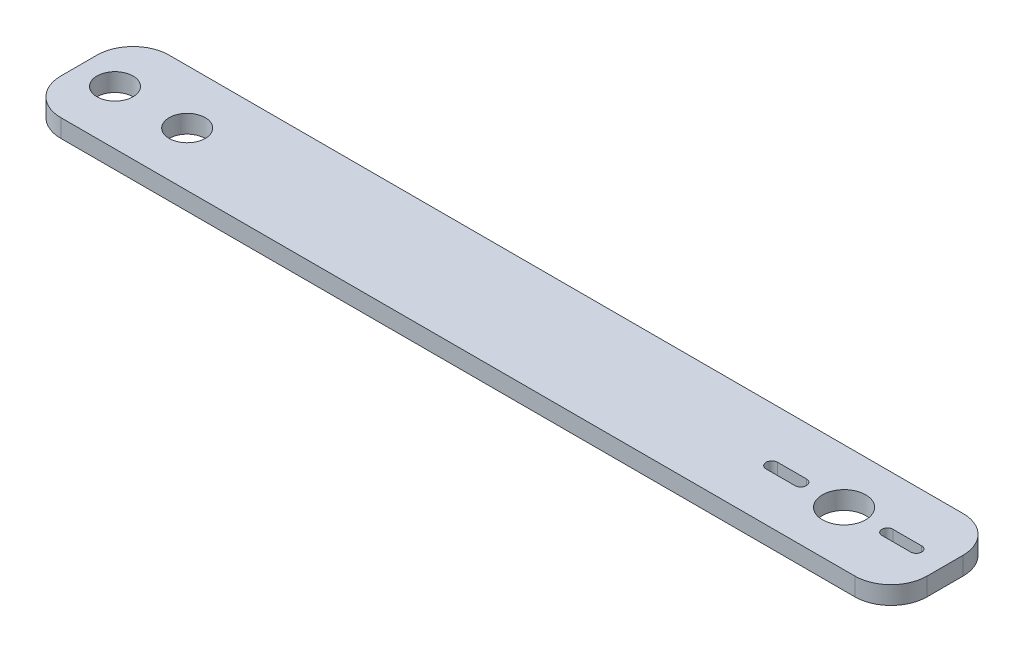
ISO-10303-21;
HEADER;
FILE_DESCRIPTION(('STEP AP214'),'2;1');
FILE_NAME('part.step','',(''),(''),'','','');
FILE_SCHEMA(('AUTOMOTIVE_DESIGN { 1 0 10303 214 1 1 1 1 }'));
ENDSEC;
DATA;
#1=APPLICATION_CONTEXT('core data for automotive mechanical design processes');
#2=APPLICATION_PROTOCOL_DEFINITION('international standard','automotive_design',2000,#1);
#3=PRODUCT_CONTEXT('',#1,'mechanical');
#4=PRODUCT('Part','Part','',(#3));
#5=PRODUCT_RELATED_PRODUCT_CATEGORY('part','',(#4));
#6=PRODUCT_DEFINITION_FORMATION('','',#4);
#7=PRODUCT_DEFINITION_CONTEXT('part definition',#1,'design');
#8=PRODUCT_DEFINITION('design','',#6,#7);
#9=PRODUCT_DEFINITION_SHAPE('','',#8);
#10=(LENGTH_UNIT() NAMED_UNIT(*) SI_UNIT(.MILLI.,.METRE.));
#11=(NAMED_UNIT(*) PLANE_ANGLE_UNIT() SI_UNIT($,.RADIAN.));
#12=(NAMED_UNIT(*) SI_UNIT($,.STERADIAN.) SOLID_ANGLE_UNIT());
#13=UNCERTAINTY_MEASURE_WITH_UNIT(LENGTH_MEASURE(1.E-05),#10,'distance_accuracy_value','');
#14=(GEOMETRIC_REPRESENTATION_CONTEXT(3) GLOBAL_UNCERTAINTY_ASSIGNED_CONTEXT((#13)) GLOBAL_UNIT_ASSIGNED_CONTEXT((#10,
#11,#12)) REPRESENTATION_CONTEXT('',''));
#15=CARTESIAN_POINT('',(0.,0.,0.));
#16=DIRECTION('',(0.,0.,1.));
#17=DIRECTION('',(1.,0.,0.));
#18=AXIS2_PLACEMENT_3D('',#15,#16,#17);
#19=CARTESIAN_POINT('',(-54.3979810745286,3.175,-16.9498549690388));
#20=DIRECTION('',(1.,0.,0.));
#21=DIRECTION('',(0.,0.,-1.));
#22=AXIS2_PLACEMENT_3D('',#19,#20,#21);
#23=PLANE('',#22);
#24=DIRECTION('',(0.,0.,1.));
#25=VECTOR('',#24,1.);
#26=CARTESIAN_POINT('',(-54.3979810745286,3.175,-16.9498549690388));
#27=LINE('',#26,#25);
#28=CARTESIAN_POINT('',(-54.3979810745286,3.175,-10.5998549690389));
#29=VERTEX_POINT('',#28);
#30=CARTESIAN_POINT('',(-54.3979810745286,3.175,-4.24985496903885));
#31=VERTEX_POINT('',#30);
#32=EDGE_CURVE('E231',#29,#31,#27,.T.);
#33=ORIENTED_EDGE('',*,*,#32,.F.);
#34=DIRECTION('',(0.,-1.,0.));
#35=VECTOR('',#34,1.);
#36=CARTESIAN_POINT('',(-54.3979810745286,3.175,-10.5998549690388));
#37=LINE('',#36,#35);
#38=CARTESIAN_POINT('',(-54.3979810745286,0.,-10.5998549690389));
#39=VERTEX_POINT('',#38);
#40=EDGE_CURVE('E11',#29,#39,#37,.T.);
#41=ORIENTED_EDGE('',*,*,#40,.T.);
#42=DIRECTION('',(0.,0.,1.));
#43=VECTOR('',#42,1.);
#44=CARTESIAN_POINT('',(-54.3979810745286,0.,-16.9498549690388));
#45=LINE('',#44,#43);
#46=CARTESIAN_POINT('',(-54.3979810745286,0.,-4.24985496903885));
#47=VERTEX_POINT('',#46);
#48=EDGE_CURVE('E245',#39,#47,#45,.T.);
#49=ORIENTED_EDGE('',*,*,#48,.T.);
#50=DIRECTION('',(0.,-1.,0.));
#51=VECTOR('',#50,1.);
#52=CARTESIAN_POINT('',(-54.3979810745286,3.175,-4.24985496903885));
#53=LINE('',#52,#51);
#54=EDGE_CURVE('E42',#47,#31,#53,.F.);
#55=ORIENTED_EDGE('',*,*,#54,.T.);
#56=EDGE_LOOP('',(#33,#41,#49,#55));
#57=FACE_BOUND('',#56,.T.);
#58=ADVANCED_FACE('F34',(#57),#23,.F.);
#59=CARTESIAN_POINT('',(-54.3979810745286,3.175,2.10014503096115));
#60=DIRECTION('',(0.,0.,-1.));
#61=DIRECTION('',(-1.,0.,0.));
#62=AXIS2_PLACEMENT_3D('',#59,#60,#61);
#63=PLANE('',#62);
#64=DIRECTION('',(1.,0.,0.));
#65=VECTOR('',#64,1.);
#66=CARTESIAN_POINT('',(-54.3979810745286,0.,2.10014503096115));
#67=LINE('',#66,#65);
#68=CARTESIAN_POINT('',(-48.0479810745286,0.,2.10014503096115));
#69=VERTEX_POINT('',#68);
#70=CARTESIAN_POINT('',(91.6520189254713,0.,2.10014503096115));
#71=VERTEX_POINT('',#70);
#72=EDGE_CURVE('E248',#69,#71,#67,.T.);
#73=ORIENTED_EDGE('',*,*,#72,.T.);
#74=DIRECTION('',(0.,-1.,0.));
#75=VECTOR('',#74,1.);
#76=CARTESIAN_POINT('',(91.6520189254714,3.175,2.10014503096115));
#77=LINE('',#76,#75);
#78=CARTESIAN_POINT('',(91.6520189254713,3.175,2.10014503096115));
#79=VERTEX_POINT('',#78);
#80=EDGE_CURVE('E285',#71,#79,#77,.F.);
#81=ORIENTED_EDGE('',*,*,#80,.T.);
#82=DIRECTION('',(1.,0.,0.));
#83=VECTOR('',#82,1.);
#84=CARTESIAN_POINT('',(-54.3979810745286,3.175,2.10014503096115));
#85=LINE('',#84,#83);
#86=CARTESIAN_POINT('',(-48.0479810745286,3.175,2.10014503096115));
#87=VERTEX_POINT('',#86);
#88=EDGE_CURVE('E234',#87,#79,#85,.T.);
#89=ORIENTED_EDGE('',*,*,#88,.F.);
#90=DIRECTION('',(0.,-1.,0.));
#91=VECTOR('',#90,1.);
#92=CARTESIAN_POINT('',(-48.0479810745286,3.175,2.10014503096115));
#93=LINE('',#92,#91);
#94=EDGE_CURVE('E282',#87,#69,#93,.T.);
#95=ORIENTED_EDGE('',*,*,#94,.T.);
#96=EDGE_LOOP('',(#73,#81,#89,#95));
#97=FACE_BOUND('',#96,.T.);
#98=ADVANCED_FACE('F300',(#97),#63,.F.);
#99=CARTESIAN_POINT('',(98.0020189254714,3.175,-16.9498549690388));
#100=DIRECTION('',(-1.,0.,0.));
#101=DIRECTION('',(0.,0.,1.));
#102=AXIS2_PLACEMENT_3D('',#99,#100,#101);
#103=PLANE('',#102);
#104=DIRECTION('',(0.,0.,-1.));
#105=VECTOR('',#104,1.);
#106=CARTESIAN_POINT('',(98.0020189254714,0.,-16.9498549690388));
#107=LINE('',#106,#105);
#108=CARTESIAN_POINT('',(98.0020189254714,0.,-4.24985496903885));
#109=VERTEX_POINT('',#108);
#110=CARTESIAN_POINT('',(98.0020189254714,0.,-10.5998549690389));
#111=VERTEX_POINT('',#110);
#112=EDGE_CURVE('E252',#109,#111,#107,.T.);
#113=ORIENTED_EDGE('',*,*,#112,.T.);
#114=DIRECTION('',(0.,-1.,0.));
#115=VECTOR('',#114,1.);
#116=CARTESIAN_POINT('',(98.0020189254714,3.175,-10.5998549690388));
#117=LINE('',#116,#115);
#118=CARTESIAN_POINT('',(98.0020189254714,3.175,-10.5998549690389));
#119=VERTEX_POINT('',#118);
#120=EDGE_CURVE('E272',#111,#119,#117,.F.);
#121=ORIENTED_EDGE('',*,*,#120,.T.);
#122=DIRECTION('',(0.,0.,-1.));
#123=VECTOR('',#122,1.);
#124=CARTESIAN_POINT('',(98.0020189254714,3.175,-16.9498549690388));
#125=LINE('',#124,#123);
#126=CARTESIAN_POINT('',(98.0020189254714,3.175,-4.24985496903885));
#127=VERTEX_POINT('',#126);
#128=EDGE_CURVE('E238',#127,#119,#125,.T.);
#129=ORIENTED_EDGE('',*,*,#128,.F.);
#130=DIRECTION('',(0.,-1.,0.));
#131=VECTOR('',#130,1.);
#132=CARTESIAN_POINT('',(98.0020189254714,3.175,-4.24985496903885));
#133=LINE('',#132,#131);
#134=EDGE_CURVE('E269',#127,#109,#133,.T.);
#135=ORIENTED_EDGE('',*,*,#134,.T.);
#136=EDGE_LOOP('',(#113,#121,#129,#135));
#137=FACE_BOUND('',#136,.T.);
#138=ADVANCED_FACE('F311',(#137),#103,.F.);
#139=CARTESIAN_POINT('',(-54.3979810745286,3.175,-16.9498549690388));
#140=DIRECTION('',(0.,0.,1.));
#141=DIRECTION('',(1.,0.,0.));
#142=AXIS2_PLACEMENT_3D('',#139,#140,#141);
#143=PLANE('',#142);
#144=DIRECTION('',(-1.,0.,0.));
#145=VECTOR('',#144,1.);
#146=CARTESIAN_POINT('',(-54.3979810745286,3.175,-16.9498549690388));
#147=LINE('',#146,#145);
#148=CARTESIAN_POINT('',(91.6520189254713,3.175,-16.9498549690388));
#149=VERTEX_POINT('',#148);
#150=CARTESIAN_POINT('',(-48.0479810745286,3.175,-16.9498549690388));
#151=VERTEX_POINT('',#150);
#152=EDGE_CURVE('E241',#149,#151,#147,.T.);
#153=ORIENTED_EDGE('',*,*,#152,.F.);
#154=DIRECTION('',(0.,-1.,0.));
#155=VECTOR('',#154,1.);
#156=CARTESIAN_POINT('',(91.6520189254714,3.175,-16.9498549690388));
#157=LINE('',#156,#155);
#158=CARTESIAN_POINT('',(91.6520189254713,0.,-16.9498549690388));
#159=VERTEX_POINT('',#158);
#160=EDGE_CURVE('E258',#149,#159,#157,.T.);
#161=ORIENTED_EDGE('',*,*,#160,.T.);
#162=DIRECTION('',(-1.,0.,0.));
#163=VECTOR('',#162,1.);
#164=CARTESIAN_POINT('',(-54.3979810745286,0.,-16.9498549690388));
#165=LINE('',#164,#163);
#166=CARTESIAN_POINT('',(-48.0479810745286,0.,-16.9498549690388));
#167=VERTEX_POINT('',#166);
#168=EDGE_CURVE('E235',#159,#167,#165,.T.);
#169=ORIENTED_EDGE('',*,*,#168,.T.);
#170=DIRECTION('',(0.,-1.,0.));
#171=VECTOR('',#170,1.);
#172=CARTESIAN_POINT('',(-48.0479810745286,3.175,-16.9498549690388));
#173=LINE('',#172,#171);
#174=EDGE_CURVE('E244',#167,#151,#173,.F.);
#175=ORIENTED_EDGE('',*,*,#174,.T.);
#176=EDGE_LOOP('',(#153,#161,#169,#175));
#177=FACE_BOUND('',#176,.T.);
#178=ADVANCED_FACE('F319',(#177),#143,.F.);
#179=CARTESIAN_POINT('',(0.,3.175,0.));
#180=DIRECTION('',(0.,1.,0.));
#181=DIRECTION('',(0.,0.,1.));
#182=AXIS2_PLACEMENT_3D('',#179,#180,#181);
#183=PLANE('',#182);
#184=CARTESIAN_POINT('',(-48.0479810745286,3.175,-7.42485496903885));
#185=DIRECTION('',(0.,1.,0.));
#186=DIRECTION('',(0.,0.,1.));
#187=AXIS2_PLACEMENT_3D('',#184,#185,#186);
#188=CIRCLE('',#187,3.175);
#189=CARTESIAN_POINT('',(-48.0479810745286,3.175,-4.24985496903885));
#190=VERTEX_POINT('',#189);
#191=EDGE_CURVE('E174',#190,#190,#188,.T.);
#192=ORIENTED_EDGE('',*,*,#191,.F.);
#193=EDGE_LOOP('',(#192));
#194=FACE_BOUND('',#193,.T.);
#195=CARTESIAN_POINT('',(72.6020189254714,3.175,-7.42485496903885));
#196=DIRECTION('',(0.,1.,0.));
#197=DIRECTION('',(0.,0.,1.));
#198=AXIS2_PLACEMENT_3D('',#195,#196,#197);
#199=CIRCLE('',#198,1.016);
#200=CARTESIAN_POINT('',(72.6020189254714,3.175,-6.40885496903885));
#201=VERTEX_POINT('',#200);
#202=CARTESIAN_POINT('',(72.6020189254714,3.175,-8.44085496903885));
#203=VERTEX_POINT('',#202);
#204=EDGE_CURVE('E49',#201,#203,#199,.T.);
#205=ORIENTED_EDGE('',*,*,#204,.F.);
#206=DIRECTION('',(1.,0.,0.));
#207=VECTOR('',#206,1.);
#208=CARTESIAN_POINT('',(72.6020189254714,3.175,-6.40885496903885));
#209=LINE('',#208,#207);
#210=CARTESIAN_POINT('',(67.5220189254714,3.175,-6.40885496903885));
#211=VERTEX_POINT('',#210);
#212=EDGE_CURVE('E195',#211,#201,#209,.T.);
#213=ORIENTED_EDGE('',*,*,#212,.F.);
#214=CARTESIAN_POINT('',(67.5220189254714,3.175,-7.42485496903885));
#215=DIRECTION('',(0.,1.,0.));
#216=DIRECTION('',(0.,0.,1.));
#217=AXIS2_PLACEMENT_3D('',#214,#215,#216);
#218=CIRCLE('',#217,1.016);
#219=CARTESIAN_POINT('',(67.5220189254714,3.175,-8.44085496903885));
#220=VERTEX_POINT('',#219);
#221=EDGE_CURVE('E209',#220,#211,#218,.T.);
#222=ORIENTED_EDGE('',*,*,#221,.F.);
#223=DIRECTION('',(-1.,0.,0.));
#224=VECTOR('',#223,1.);
#225=CARTESIAN_POINT('',(72.6020189254714,3.175,-8.44085496903885));
#226=LINE('',#225,#224);
#227=EDGE_CURVE('E206',#203,#220,#226,.T.);
#228=ORIENTED_EDGE('',*,*,#227,.F.);
#229=EDGE_LOOP('',(#205,#213,#222,#228));
#230=FACE_BOUND('',#229,.T.);
#231=CARTESIAN_POINT('',(87.8420189254714,3.175,-7.42485496903885));
#232=DIRECTION('',(0.,1.,0.));
#233=DIRECTION('',(0.,0.,1.));
#234=AXIS2_PLACEMENT_3D('',#231,#232,#233);
#235=CIRCLE('',#234,0.9525);
#236=CARTESIAN_POINT('',(87.8420189254714,3.175,-8.37735496903885));
#237=VERTEX_POINT('',#236);
#238=CARTESIAN_POINT('',(87.8420189254714,3.175,-6.47235496903885));
#239=VERTEX_POINT('',#238);
#240=EDGE_CURVE('E57',#237,#239,#235,.T.);
#241=ORIENTED_EDGE('',*,*,#240,.F.);
#242=DIRECTION('',(-1.,0.,0.));
#243=VECTOR('',#242,1.);
#244=CARTESIAN_POINT('',(87.8420189254714,3.175,-8.37735496903885));
#245=LINE('',#244,#243);
#246=CARTESIAN_POINT('',(92.9220189254714,3.175,-8.37735496903885));
#247=VERTEX_POINT('',#246);
#248=EDGE_CURVE('E168',#247,#237,#245,.T.);
#249=ORIENTED_EDGE('',*,*,#248,.F.);
#250=CARTESIAN_POINT('',(92.9220189254714,3.175,-7.42485496903885));
#251=DIRECTION('',(0.,1.,0.));
#252=DIRECTION('',(0.,0.,1.));
#253=AXIS2_PLACEMENT_3D('',#250,#251,#252);
#254=CIRCLE('',#253,0.952500000000002);
#255=CARTESIAN_POINT('',(92.9220189254714,3.175,-6.47235496903885));
#256=VERTEX_POINT('',#255);
#257=EDGE_CURVE('E171',#256,#247,#254,.T.);
#258=ORIENTED_EDGE('',*,*,#257,.F.);
#259=DIRECTION('',(1.,0.,0.));
#260=VECTOR('',#259,1.);
#261=CARTESIAN_POINT('',(87.8420189254714,3.175,-6.47235496903885));
#262=LINE('',#261,#260);
#263=EDGE_CURVE('E180',#239,#256,#262,.T.);
#264=ORIENTED_EDGE('',*,*,#263,.F.);
#265=EDGE_LOOP('',(#241,#249,#258,#264));
#266=FACE_BOUND('',#265,.T.);
#267=CARTESIAN_POINT('',(80.2220189254714,3.175,-7.42485496903885));
#268=DIRECTION('',(0.,1.,0.));
#269=DIRECTION('',(0.,0.,1.));
#270=AXIS2_PLACEMENT_3D('',#267,#268,#269);
#271=CIRCLE('',#270,3.81);
#272=CARTESIAN_POINT('',(80.2220189254714,3.175,-3.61485496903885));
#273=VERTEX_POINT('',#272);
#274=EDGE_CURVE('E187',#273,#273,#271,.T.);
#275=ORIENTED_EDGE('',*,*,#274,.F.);
#276=EDGE_LOOP('',(#275));
#277=FACE_BOUND('',#276,.T.);
#278=CARTESIAN_POINT('',(-35.3479810745286,3.175,-7.42485496903885));
#279=DIRECTION('',(0.,1.,0.));
#280=DIRECTION('',(0.,0.,1.));
#281=AXIS2_PLACEMENT_3D('',#278,#279,#280);
#282=CIRCLE('',#281,3.175);
#283=CARTESIAN_POINT('',(-35.3479810745286,3.175,-4.24985496903885));
#284=VERTEX_POINT('',#283);
#285=EDGE_CURVE('E223',#284,#284,#282,.T.);
#286=ORIENTED_EDGE('',*,*,#285,.F.);
#287=EDGE_LOOP('',(#286));
#288=FACE_BOUND('',#287,.T.);
#289=ORIENTED_EDGE('',*,*,#128,.T.);
#290=CARTESIAN_POINT('',(91.6520189254714,3.175,-10.5998549690388));
#291=DIRECTION('',(0.,1.,0.));
#292=DIRECTION('',(0.,0.,1.));
#293=AXIS2_PLACEMENT_3D('',#290,#291,#292);
#294=CIRCLE('',#293,6.35);
#295=EDGE_CURVE('E280',#119,#149,#294,.T.);
#296=ORIENTED_EDGE('',*,*,#295,.T.);
#297=ORIENTED_EDGE('',*,*,#152,.T.);
#298=CARTESIAN_POINT('',(-48.0479810745286,3.175,-10.5998549690388));
#299=DIRECTION('',(0.,1.,0.));
#300=DIRECTION('',(0.,0.,1.));
#301=AXIS2_PLACEMENT_3D('',#298,#299,#300);
#302=CIRCLE('',#301,6.35);
#303=EDGE_CURVE('E276',#151,#29,#302,.T.);
#304=ORIENTED_EDGE('',*,*,#303,.T.);
#305=ORIENTED_EDGE('',*,*,#32,.T.);
#306=CARTESIAN_POINT('',(-48.0479810745286,3.175,-4.24985496903885));
#307=DIRECTION('',(0.,1.,0.));
#308=DIRECTION('',(0.,0.,1.));
#309=AXIS2_PLACEMENT_3D('',#306,#307,#308);
#310=CIRCLE('',#309,6.35);
#311=EDGE_CURVE('E274',#31,#87,#310,.T.);
#312=ORIENTED_EDGE('',*,*,#311,.T.);
#313=ORIENTED_EDGE('',*,*,#88,.T.);
#314=CARTESIAN_POINT('',(91.6520189254714,3.175,-4.24985496903885));
#315=DIRECTION('',(0.,1.,0.));
#316=DIRECTION('',(0.,0.,1.));
#317=AXIS2_PLACEMENT_3D('',#314,#315,#316);
#318=CIRCLE('',#317,6.35);
#319=EDGE_CURVE('E278',#79,#127,#318,.T.);
#320=ORIENTED_EDGE('',*,*,#319,.T.);
#321=EDGE_LOOP('',(#289,#296,#297,#304,#305,#312,#313,#320));
#322=FACE_BOUND('',#321,.T.);
#323=ADVANCED_FACE('F294',(#194,#230,#266,#277,#288,#322),#183,.T.);
#324=CARTESIAN_POINT('',(0.,0.,0.));
#325=DIRECTION('',(0.,1.,0.));
#326=DIRECTION('',(0.,0.,1.));
#327=AXIS2_PLACEMENT_3D('',#324,#325,#326);
#328=PLANE('',#327);
#329=CARTESIAN_POINT('',(-48.0479810745286,0.,-7.42485496903885));
#330=DIRECTION('',(0.,1.,0.));
#331=DIRECTION('',(0.,0.,1.));
#332=AXIS2_PLACEMENT_3D('',#329,#330,#331);
#333=CIRCLE('',#332,3.175);
#334=CARTESIAN_POINT('',(-48.0479810745286,0.,-4.24985496903885));
#335=VERTEX_POINT('',#334);
#336=EDGE_CURVE('E249',#335,#335,#333,.T.);
#337=ORIENTED_EDGE('',*,*,#336,.T.);
#338=EDGE_LOOP('',(#337));
#339=FACE_BOUND('',#338,.T.);
#340=DIRECTION('',(1.,0.,0.));
#341=VECTOR('',#340,1.);
#342=CARTESIAN_POINT('',(72.6020189254714,0.,-6.40885496903885));
#343=LINE('',#342,#341);
#344=CARTESIAN_POINT('',(67.5220189254714,0.,-6.40885496903885));
#345=VERTEX_POINT('',#344);
#346=CARTESIAN_POINT('',(72.6020189254714,0.,-6.40885496903885));
#347=VERTEX_POINT('',#346);
#348=EDGE_CURVE('E201',#345,#347,#343,.T.);
#349=ORIENTED_EDGE('',*,*,#348,.T.);
#350=CARTESIAN_POINT('',(72.6020189254714,0.,-7.42485496903885));
#351=DIRECTION('',(0.,1.,0.));
#352=DIRECTION('',(0.,0.,1.));
#353=AXIS2_PLACEMENT_3D('',#350,#351,#352);
#354=CIRCLE('',#353,1.016);
#355=CARTESIAN_POINT('',(72.6020189254714,0.,-8.44085496903885));
#356=VERTEX_POINT('',#355);
#357=EDGE_CURVE('E191',#347,#356,#354,.T.);
#358=ORIENTED_EDGE('',*,*,#357,.T.);
#359=DIRECTION('',(-1.,0.,0.));
#360=VECTOR('',#359,1.);
#361=CARTESIAN_POINT('',(72.6020189254714,0.,-8.44085496903885));
#362=LINE('',#361,#360);
#363=CARTESIAN_POINT('',(67.5220189254714,0.,-8.44085496903885));
#364=VERTEX_POINT('',#363);
#365=EDGE_CURVE('E194',#356,#364,#362,.T.);
#366=ORIENTED_EDGE('',*,*,#365,.T.);
#367=CARTESIAN_POINT('',(67.5220189254714,0.,-7.42485496903885));
#368=DIRECTION('',(0.,1.,0.));
#369=DIRECTION('',(0.,0.,1.));
#370=AXIS2_PLACEMENT_3D('',#367,#368,#369);
#371=CIRCLE('',#370,1.016);
#372=EDGE_CURVE('E198',#364,#345,#371,.T.);
#373=ORIENTED_EDGE('',*,*,#372,.T.);
#374=EDGE_LOOP('',(#349,#358,#366,#373));
#375=FACE_BOUND('',#374,.T.);
#376=DIRECTION('',(-1.,0.,0.));
#377=VECTOR('',#376,1.);
#378=CARTESIAN_POINT('',(87.8420189254714,0.,-8.37735496903885));
#379=LINE('',#378,#377);
#380=CARTESIAN_POINT('',(92.9220189254714,0.,-8.37735496903885));
#381=VERTEX_POINT('',#380);
#382=CARTESIAN_POINT('',(87.8420189254714,0.,-8.37735496903885));
#383=VERTEX_POINT('',#382);
#384=EDGE_CURVE('E155',#381,#383,#379,.T.);
#385=ORIENTED_EDGE('',*,*,#384,.T.);
#386=CARTESIAN_POINT('',(87.8420189254714,0.,-7.42485496903885));
#387=DIRECTION('',(0.,1.,0.));
#388=DIRECTION('',(0.,0.,1.));
#389=AXIS2_PLACEMENT_3D('',#386,#387,#388);
#390=CIRCLE('',#389,0.9525);
#391=CARTESIAN_POINT('',(87.8420189254714,0.,-6.47235496903885));
#392=VERTEX_POINT('',#391);
#393=EDGE_CURVE('E149',#383,#392,#390,.T.);
#394=ORIENTED_EDGE('',*,*,#393,.T.);
#395=DIRECTION('',(1.,0.,0.));
#396=VECTOR('',#395,1.);
#397=CARTESIAN_POINT('',(87.8420189254714,0.,-6.47235496903885));
#398=LINE('',#397,#396);
#399=CARTESIAN_POINT('',(92.9220189254714,0.,-6.47235496903885));
#400=VERTEX_POINT('',#399);
#401=EDGE_CURVE('E159',#392,#400,#398,.T.);
#402=ORIENTED_EDGE('',*,*,#401,.T.);
#403=CARTESIAN_POINT('',(92.9220189254714,0.,-7.42485496903885));
#404=DIRECTION('',(0.,1.,0.));
#405=DIRECTION('',(0.,0.,1.));
#406=AXIS2_PLACEMENT_3D('',#403,#404,#405);
#407=CIRCLE('',#406,0.952500000000002);
#408=EDGE_CURVE('E163',#400,#381,#407,.T.);
#409=ORIENTED_EDGE('',*,*,#408,.T.);
#410=EDGE_LOOP('',(#385,#394,#402,#409));
#411=FACE_BOUND('',#410,.T.);
#412=CARTESIAN_POINT('',(80.2220189254714,0.,-7.42485496903885));
#413=DIRECTION('',(0.,1.,0.));
#414=DIRECTION('',(0.,0.,1.));
#415=AXIS2_PLACEMENT_3D('',#412,#413,#414);
#416=CIRCLE('',#415,3.81);
#417=CARTESIAN_POINT('',(80.2220189254714,0.,-3.61485496903885));
#418=VERTEX_POINT('',#417);
#419=EDGE_CURVE('E226',#418,#418,#416,.T.);
#420=ORIENTED_EDGE('',*,*,#419,.T.);
#421=EDGE_LOOP('',(#420));
#422=FACE_BOUND('',#421,.T.);
#423=CARTESIAN_POINT('',(-35.3479810745286,0.,-7.42485496903885));
#424=DIRECTION('',(0.,1.,0.));
#425=DIRECTION('',(0.,0.,1.));
#426=AXIS2_PLACEMENT_3D('',#423,#424,#425);
#427=CIRCLE('',#426,3.175);
#428=CARTESIAN_POINT('',(-35.3479810745286,0.,-4.24985496903885));
#429=VERTEX_POINT('',#428);
#430=EDGE_CURVE('E220',#429,#429,#427,.T.);
#431=ORIENTED_EDGE('',*,*,#430,.T.);
#432=EDGE_LOOP('',(#431));
#433=FACE_BOUND('',#432,.T.);
#434=ORIENTED_EDGE('',*,*,#168,.F.);
#435=CARTESIAN_POINT('',(91.6520189254714,0.,-10.5998549690388));
#436=DIRECTION('',(0.,1.,0.));
#437=DIRECTION('',(0.,0.,1.));
#438=AXIS2_PLACEMENT_3D('',#435,#436,#437);
#439=CIRCLE('',#438,6.35);
#440=EDGE_CURVE('E267',#159,#111,#439,.F.);
#441=ORIENTED_EDGE('',*,*,#440,.T.);
#442=ORIENTED_EDGE('',*,*,#112,.F.);
#443=CARTESIAN_POINT('',(91.6520189254714,0.,-4.24985496903885));
#444=DIRECTION('',(0.,1.,0.));
#445=DIRECTION('',(0.,0.,1.));
#446=AXIS2_PLACEMENT_3D('',#443,#444,#445);
#447=CIRCLE('',#446,6.35);
#448=EDGE_CURVE('E265',#109,#71,#447,.F.);
#449=ORIENTED_EDGE('',*,*,#448,.T.);
#450=ORIENTED_EDGE('',*,*,#72,.F.);
#451=CARTESIAN_POINT('',(-48.0479810745286,0.,-4.24985496903885));
#452=DIRECTION('',(0.,1.,0.));
#453=DIRECTION('',(0.,0.,1.));
#454=AXIS2_PLACEMENT_3D('',#451,#452,#453);
#455=CIRCLE('',#454,6.35);
#456=EDGE_CURVE('E261',#69,#47,#455,.F.);
#457=ORIENTED_EDGE('',*,*,#456,.T.);
#458=ORIENTED_EDGE('',*,*,#48,.F.);
#459=CARTESIAN_POINT('',(-48.0479810745286,0.,-10.5998549690388));
#460=DIRECTION('',(0.,1.,0.));
#461=DIRECTION('',(0.,0.,1.));
#462=AXIS2_PLACEMENT_3D('',#459,#460,#461);
#463=CIRCLE('',#462,6.35);
#464=EDGE_CURVE('E263',#39,#167,#463,.F.);
#465=ORIENTED_EDGE('',*,*,#464,.T.);
#466=EDGE_LOOP('',(#434,#441,#442,#449,#450,#457,#458,#465));
#467=FACE_BOUND('',#466,.T.);
#468=ADVANCED_FACE('F165',(#339,#375,#411,#422,#433,#467),#328,.F.);
#469=CARTESIAN_POINT('',(91.6520189254714,3.175,-10.5998549690388));
#470=DIRECTION('',(0.,-1.,0.));
#471=DIRECTION('',(0.,0.,-1.));
#472=AXIS2_PLACEMENT_3D('',#469,#470,#471);
#473=CYLINDRICAL_SURFACE('',#472,6.35);
#474=ORIENTED_EDGE('',*,*,#295,.F.);
#475=ORIENTED_EDGE('',*,*,#120,.F.);
#476=ORIENTED_EDGE('',*,*,#440,.F.);
#477=ORIENTED_EDGE('',*,*,#160,.F.);
#478=EDGE_LOOP('',(#474,#475,#476,#477));
#479=FACE_BOUND('',#478,.T.);
#480=ADVANCED_FACE('F317',(#479),#473,.T.);
#481=CARTESIAN_POINT('',(91.6520189254714,3.175,-4.24985496903885));
#482=DIRECTION('',(0.,-1.,0.));
#483=DIRECTION('',(0.,0.,-1.));
#484=AXIS2_PLACEMENT_3D('',#481,#482,#483);
#485=CYLINDRICAL_SURFACE('',#484,6.35);
#486=ORIENTED_EDGE('',*,*,#319,.F.);
#487=ORIENTED_EDGE('',*,*,#80,.F.);
#488=ORIENTED_EDGE('',*,*,#448,.F.);
#489=ORIENTED_EDGE('',*,*,#134,.F.);
#490=EDGE_LOOP('',(#486,#487,#488,#489));
#491=FACE_BOUND('',#490,.T.);
#492=ADVANCED_FACE('F308',(#491),#485,.T.);
#493=CARTESIAN_POINT('',(-48.0479810745286,3.175,-10.5998549690388));
#494=DIRECTION('',(0.,-1.,0.));
#495=DIRECTION('',(0.,0.,-1.));
#496=AXIS2_PLACEMENT_3D('',#493,#494,#495);
#497=CYLINDRICAL_SURFACE('',#496,6.35);
#498=ORIENTED_EDGE('',*,*,#303,.F.);
#499=ORIENTED_EDGE('',*,*,#174,.F.);
#500=ORIENTED_EDGE('',*,*,#464,.F.);
#501=ORIENTED_EDGE('',*,*,#40,.F.);
#502=EDGE_LOOP('',(#498,#499,#500,#501));
#503=FACE_BOUND('',#502,.T.);
#504=ADVANCED_FACE('F322',(#503),#497,.T.);
#505=CARTESIAN_POINT('',(-48.0479810745286,3.175,-4.24985496903885));
#506=DIRECTION('',(0.,-1.,0.));
#507=DIRECTION('',(0.,0.,-1.));
#508=AXIS2_PLACEMENT_3D('',#505,#506,#507);
#509=CYLINDRICAL_SURFACE('',#508,6.35);
#510=ORIENTED_EDGE('',*,*,#311,.F.);
#511=ORIENTED_EDGE('',*,*,#54,.F.);
#512=ORIENTED_EDGE('',*,*,#456,.F.);
#513=ORIENTED_EDGE('',*,*,#94,.F.);
#514=EDGE_LOOP('',(#510,#511,#512,#513));
#515=FACE_BOUND('',#514,.T.);
#516=ADVANCED_FACE('F36',(#515),#509,.T.);
#517=CARTESIAN_POINT('',(-35.3479810745286,0.,-7.42485496903885));
#518=DIRECTION('',(0.,1.,0.));
#519=DIRECTION('',(0.,0.,1.));
#520=AXIS2_PLACEMENT_3D('',#517,#518,#519);
#521=CYLINDRICAL_SURFACE('',#520,3.175);
#522=ORIENTED_EDGE('',*,*,#430,.F.);
#523=EDGE_LOOP('',(#522));
#524=FACE_BOUND('',#523,.T.);
#525=ORIENTED_EDGE('',*,*,#285,.T.);
#526=EDGE_LOOP('',(#525));
#527=FACE_BOUND('',#526,.T.);
#528=ADVANCED_FACE('F328',(#524,#527),#521,.F.);
#529=CARTESIAN_POINT('',(80.2220189254714,0.,-7.42485496903885));
#530=DIRECTION('',(0.,1.,0.));
#531=DIRECTION('',(0.,0.,1.));
#532=AXIS2_PLACEMENT_3D('',#529,#530,#531);
#533=CYLINDRICAL_SURFACE('',#532,3.81);
#534=ORIENTED_EDGE('',*,*,#419,.F.);
#535=EDGE_LOOP('',(#534));
#536=FACE_BOUND('',#535,.T.);
#537=ORIENTED_EDGE('',*,*,#274,.T.);
#538=EDGE_LOOP('',(#537));
#539=FACE_BOUND('',#538,.T.);
#540=ADVANCED_FACE('F384',(#536,#539),#533,.F.);
#541=CARTESIAN_POINT('',(87.8420189254714,0.,-7.42485496903885));
#542=DIRECTION('',(0.,1.,0.));
#543=DIRECTION('',(0.,0.,1.));
#544=AXIS2_PLACEMENT_3D('',#541,#542,#543);
#545=CYLINDRICAL_SURFACE('',#544,0.9525);
#546=ORIENTED_EDGE('',*,*,#240,.T.);
#547=DIRECTION('',(0.,1.,0.));
#548=VECTOR('',#547,1.);
#549=CARTESIAN_POINT('',(87.8420189254714,0.,-6.47235496903885));
#550=LINE('',#549,#548);
#551=EDGE_CURVE('E145',#392,#239,#550,.T.);
#552=ORIENTED_EDGE('',*,*,#551,.F.);
#553=ORIENTED_EDGE('',*,*,#393,.F.);
#554=DIRECTION('',(0.,1.,0.));
#555=VECTOR('',#554,1.);
#556=CARTESIAN_POINT('',(87.8420189254714,0.,-8.37735496903885));
#557=LINE('',#556,#555);
#558=EDGE_CURVE('E185',#383,#237,#557,.T.);
#559=ORIENTED_EDGE('',*,*,#558,.T.);
#560=EDGE_LOOP('',(#546,#552,#553,#559));
#561=FACE_BOUND('',#560,.T.);
#562=ADVANCED_FACE('F147',(#561),#545,.F.);
#563=CARTESIAN_POINT('',(87.8420189254714,0.,-8.37735496903885));
#564=DIRECTION('',(0.,0.,-1.));
#565=DIRECTION('',(-1.,0.,0.));
#566=AXIS2_PLACEMENT_3D('',#563,#564,#565);
#567=PLANE('',#566);
#568=ORIENTED_EDGE('',*,*,#248,.T.);
#569=ORIENTED_EDGE('',*,*,#558,.F.);
#570=ORIENTED_EDGE('',*,*,#384,.F.);
#571=DIRECTION('',(0.,1.,0.));
#572=VECTOR('',#571,1.);
#573=CARTESIAN_POINT('',(92.9220189254714,0.,-8.37735496903885));
#574=LINE('',#573,#572);
#575=EDGE_CURVE('E188',#381,#247,#574,.T.);
#576=ORIENTED_EDGE('',*,*,#575,.T.);
#577=EDGE_LOOP('',(#568,#569,#570,#576));
#578=FACE_BOUND('',#577,.T.);
#579=ADVANCED_FACE('F402',(#578),#567,.F.);
#580=CARTESIAN_POINT('',(92.9220189254714,0.,-7.42485496903885));
#581=DIRECTION('',(0.,1.,0.));
#582=DIRECTION('',(0.,0.,1.));
#583=AXIS2_PLACEMENT_3D('',#580,#581,#582);
#584=CYLINDRICAL_SURFACE('',#583,0.952500000000002);
#585=ORIENTED_EDGE('',*,*,#257,.T.);
#586=ORIENTED_EDGE('',*,*,#575,.F.);
#587=ORIENTED_EDGE('',*,*,#408,.F.);
#588=DIRECTION('',(0.,1.,0.));
#589=VECTOR('',#588,1.);
#590=CARTESIAN_POINT('',(92.9220189254714,0.,-6.47235496903885));
#591=LINE('',#590,#589);
#592=EDGE_CURVE('E154',#400,#256,#591,.T.);
#593=ORIENTED_EDGE('',*,*,#592,.T.);
#594=EDGE_LOOP('',(#585,#586,#587,#593));
#595=FACE_BOUND('',#594,.T.);
#596=ADVANCED_FACE('F411',(#595),#584,.F.);
#597=CARTESIAN_POINT('',(87.8420189254714,0.,-6.47235496903885));
#598=DIRECTION('',(0.,0.,1.));
#599=DIRECTION('',(1.,0.,0.));
#600=AXIS2_PLACEMENT_3D('',#597,#598,#599);
#601=PLANE('',#600);
#602=ORIENTED_EDGE('',*,*,#263,.T.);
#603=ORIENTED_EDGE('',*,*,#592,.F.);
#604=ORIENTED_EDGE('',*,*,#401,.F.);
#605=ORIENTED_EDGE('',*,*,#551,.T.);
#606=EDGE_LOOP('',(#602,#603,#604,#605));
#607=FACE_BOUND('',#606,.T.);
#608=ADVANCED_FACE('F160',(#607),#601,.F.);
#609=CARTESIAN_POINT('',(72.6020189254714,0.,-7.42485496903885));
#610=DIRECTION('',(0.,1.,0.));
#611=DIRECTION('',(0.,0.,1.));
#612=AXIS2_PLACEMENT_3D('',#609,#610,#611);
#613=CYLINDRICAL_SURFACE('',#612,1.016);
#614=ORIENTED_EDGE('',*,*,#204,.T.);
#615=DIRECTION('',(0.,1.,0.));
#616=VECTOR('',#615,1.);
#617=CARTESIAN_POINT('',(72.6020189254714,0.,-8.44085496903885));
#618=LINE('',#617,#616);
#619=EDGE_CURVE('E204',#356,#203,#618,.T.);
#620=ORIENTED_EDGE('',*,*,#619,.F.);
#621=ORIENTED_EDGE('',*,*,#357,.F.);
#622=DIRECTION('',(0.,1.,0.));
#623=VECTOR('',#622,1.);
#624=CARTESIAN_POINT('',(72.6020189254714,0.,-6.40885496903885));
#625=LINE('',#624,#623);
#626=EDGE_CURVE('E181',#347,#201,#625,.T.);
#627=ORIENTED_EDGE('',*,*,#626,.T.);
#628=EDGE_LOOP('',(#614,#620,#621,#627));
#629=FACE_BOUND('',#628,.T.);
#630=ADVANCED_FACE('F430',(#629),#613,.F.);
#631=CARTESIAN_POINT('',(72.6020189254714,0.,-6.40885496903885));
#632=DIRECTION('',(0.,0.,1.));
#633=DIRECTION('',(1.,0.,0.));
#634=AXIS2_PLACEMENT_3D('',#631,#632,#633);
#635=PLANE('',#634);
#636=ORIENTED_EDGE('',*,*,#212,.T.);
#637=ORIENTED_EDGE('',*,*,#626,.F.);
#638=ORIENTED_EDGE('',*,*,#348,.F.);
#639=DIRECTION('',(0.,1.,0.));
#640=VECTOR('',#639,1.);
#641=CARTESIAN_POINT('',(67.5220189254714,0.,-6.40885496903885));
#642=LINE('',#641,#640);
#643=EDGE_CURVE('E215',#345,#211,#642,.T.);
#644=ORIENTED_EDGE('',*,*,#643,.T.);
#645=EDGE_LOOP('',(#636,#637,#638,#644));
#646=FACE_BOUND('',#645,.T.);
#647=ADVANCED_FACE('F439',(#646),#635,.F.);
#648=CARTESIAN_POINT('',(67.5220189254714,0.,-7.42485496903885));
#649=DIRECTION('',(0.,1.,0.));
#650=DIRECTION('',(0.,0.,1.));
#651=AXIS2_PLACEMENT_3D('',#648,#649,#650);
#652=CYLINDRICAL_SURFACE('',#651,1.016);
#653=ORIENTED_EDGE('',*,*,#221,.T.);
#654=ORIENTED_EDGE('',*,*,#643,.F.);
#655=ORIENTED_EDGE('',*,*,#372,.F.);
#656=DIRECTION('',(0.,1.,0.));
#657=VECTOR('',#656,1.);
#658=CARTESIAN_POINT('',(67.5220189254714,0.,-8.44085496903885));
#659=LINE('',#658,#657);
#660=EDGE_CURVE('E217',#364,#220,#659,.T.);
#661=ORIENTED_EDGE('',*,*,#660,.T.);
#662=EDGE_LOOP('',(#653,#654,#655,#661));
#663=FACE_BOUND('',#662,.T.);
#664=ADVANCED_FACE('F448',(#663),#652,.F.);
#665=CARTESIAN_POINT('',(72.6020189254714,0.,-8.44085496903885));
#666=DIRECTION('',(0.,0.,-1.));
#667=DIRECTION('',(-1.,0.,0.));
#668=AXIS2_PLACEMENT_3D('',#665,#666,#667);
#669=PLANE('',#668);
#670=ORIENTED_EDGE('',*,*,#227,.T.);
#671=ORIENTED_EDGE('',*,*,#660,.F.);
#672=ORIENTED_EDGE('',*,*,#365,.F.);
#673=ORIENTED_EDGE('',*,*,#619,.T.);
#674=EDGE_LOOP('',(#670,#671,#672,#673));
#675=FACE_BOUND('',#674,.T.);
#676=ADVANCED_FACE('F458',(#675),#669,.F.);
#677=CARTESIAN_POINT('',(-48.0479810745286,0.,-7.42485496903885));
#678=DIRECTION('',(0.,1.,0.));
#679=DIRECTION('',(0.,0.,1.));
#680=AXIS2_PLACEMENT_3D('',#677,#678,#679);
#681=CYLINDRICAL_SURFACE('',#680,3.175);
#682=ORIENTED_EDGE('',*,*,#336,.F.);
#683=EDGE_LOOP('',(#682));
#684=FACE_BOUND('',#683,.T.);
#685=ORIENTED_EDGE('',*,*,#191,.T.);
#686=EDGE_LOOP('',(#685));
#687=FACE_BOUND('',#686,.T.);
#688=ADVANCED_FACE('F468',(#684,#687),#681,.F.);
#689=CLOSED_SHELL('',(#58,#98,#138,#178,#323,#468,#480,#492,#504,#516,#528,#540,#562,#579,#596,
#608,#630,#647,#664,#676,#688));
#690=MANIFOLD_SOLID_BREP('B2',#689);
#691=ADVANCED_BREP_SHAPE_REPRESENTATION('',(#18,#690),#14);
#692=SHAPE_DEFINITION_REPRESENTATION(#9,#691);
ENDSEC;
END-ISO-10303-21;
